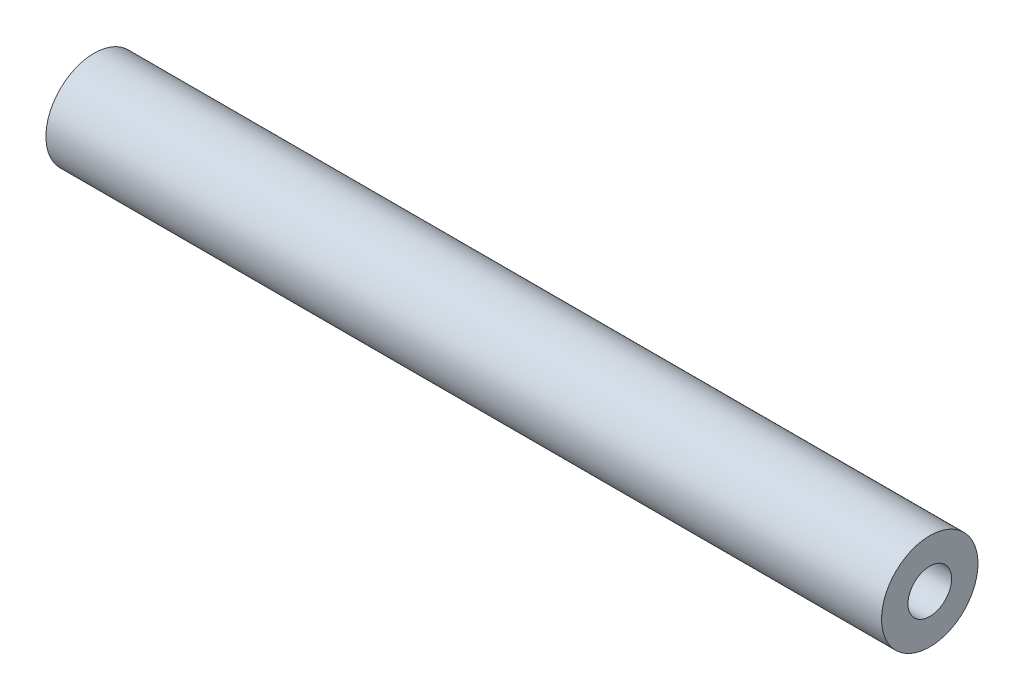
ISO-10303-21;
HEADER;
FILE_DESCRIPTION(('STEP AP214'),'2;1');
FILE_NAME('part.step','',(''),(''),'','','');
FILE_SCHEMA(('AUTOMOTIVE_DESIGN { 1 0 10303 214 1 1 1 1 }'));
ENDSEC;
DATA;
#1=APPLICATION_CONTEXT('core data for automotive mechanical design processes');
#2=APPLICATION_PROTOCOL_DEFINITION('international standard','automotive_design',2000,#1);
#3=PRODUCT_CONTEXT('',#1,'mechanical');
#4=PRODUCT('Part','Part','',(#3));
#5=PRODUCT_RELATED_PRODUCT_CATEGORY('part','',(#4));
#6=PRODUCT_DEFINITION_FORMATION('','',#4);
#7=PRODUCT_DEFINITION_CONTEXT('part definition',#1,'design');
#8=PRODUCT_DEFINITION('design','',#6,#7);
#9=PRODUCT_DEFINITION_SHAPE('','',#8);
#10=(LENGTH_UNIT() NAMED_UNIT(*) SI_UNIT(.MILLI.,.METRE.));
#11=(NAMED_UNIT(*) PLANE_ANGLE_UNIT() SI_UNIT($,.RADIAN.));
#12=(NAMED_UNIT(*) SI_UNIT($,.STERADIAN.) SOLID_ANGLE_UNIT());
#13=UNCERTAINTY_MEASURE_WITH_UNIT(LENGTH_MEASURE(1.E-05),#10,'distance_accuracy_value','');
#14=(GEOMETRIC_REPRESENTATION_CONTEXT(3) GLOBAL_UNCERTAINTY_ASSIGNED_CONTEXT((#13)) GLOBAL_UNIT_ASSIGNED_CONTEXT((#10,
#11,#12)) REPRESENTATION_CONTEXT('',''));
#15=CARTESIAN_POINT('',(0.,0.,0.));
#16=DIRECTION('',(0.,0.,1.));
#17=DIRECTION('',(1.,0.,0.));
#18=AXIS2_PLACEMENT_3D('',#15,#16,#17);
#19=CARTESIAN_POINT('',(82.55,0.,0.));
#20=DIRECTION('',(1.,0.,0.));
#21=DIRECTION('',(0.,0.,-1.));
#22=AXIS2_PLACEMENT_3D('',#19,#20,#21);
#23=PLANE('',#22);
#24=CARTESIAN_POINT('',(82.55,0.,0.));
#25=DIRECTION('',(1.,0.,0.));
#26=DIRECTION('',(0.,0.,-1.));
#27=AXIS2_PLACEMENT_3D('',#24,#25,#26);
#28=CIRCLE('',#27,4.7625);
#29=CARTESIAN_POINT('',(82.55,0.,-4.7625));
#30=VERTEX_POINT('',#29);
#31=EDGE_CURVE('E10',#30,#30,#28,.T.);
#32=ORIENTED_EDGE('',*,*,#31,.T.);
#33=EDGE_LOOP('',(#32));
#34=FACE_BOUND('',#33,.T.);
#35=CARTESIAN_POINT('',(82.55,0.,0.));
#36=DIRECTION('',(1.,0.,0.));
#37=DIRECTION('',(0.,0.,-1.));
#38=AXIS2_PLACEMENT_3D('',#35,#36,#37);
#39=CIRCLE('',#38,2.15265);
#40=CARTESIAN_POINT('',(82.55,0.,-2.15265));
#41=VERTEX_POINT('',#40);
#42=EDGE_CURVE('E42',#41,#41,#39,.T.);
#43=ORIENTED_EDGE('',*,*,#42,.F.);
#44=EDGE_LOOP('',(#43));
#45=FACE_BOUND('',#44,.T.);
#46=ADVANCED_FACE('F31',(#34,#45),#23,.T.);
#47=CARTESIAN_POINT('',(0.,0.,0.));
#48=DIRECTION('',(1.,0.,0.));
#49=DIRECTION('',(0.,0.,-1.));
#50=AXIS2_PLACEMENT_3D('',#47,#48,#49);
#51=PLANE('',#50);
#52=CARTESIAN_POINT('',(0.,0.,0.));
#53=DIRECTION('',(1.,0.,0.));
#54=DIRECTION('',(0.,0.,-1.));
#55=AXIS2_PLACEMENT_3D('',#52,#53,#54);
#56=CIRCLE('',#55,4.7625);
#57=CARTESIAN_POINT('',(0.,0.,-4.7625));
#58=VERTEX_POINT('',#57);
#59=EDGE_CURVE('E35',#58,#58,#56,.T.);
#60=ORIENTED_EDGE('',*,*,#59,.F.);
#61=EDGE_LOOP('',(#60));
#62=FACE_BOUND('',#61,.T.);
#63=CARTESIAN_POINT('',(0.,0.,0.));
#64=DIRECTION('',(1.,0.,0.));
#65=DIRECTION('',(0.,0.,-1.));
#66=AXIS2_PLACEMENT_3D('',#63,#64,#65);
#67=CIRCLE('',#66,2.15265);
#68=CARTESIAN_POINT('',(0.,0.,-2.15265));
#69=VERTEX_POINT('',#68);
#70=EDGE_CURVE('E44',#69,#69,#67,.T.);
#71=ORIENTED_EDGE('',*,*,#70,.T.);
#72=EDGE_LOOP('',(#71));
#73=FACE_BOUND('',#72,.T.);
#74=ADVANCED_FACE('F54',(#62,#73),#51,.F.);
#75=CARTESIAN_POINT('',(82.55,0.,0.));
#76=DIRECTION('',(-1.,0.,0.));
#77=DIRECTION('',(0.,0.,1.));
#78=AXIS2_PLACEMENT_3D('',#75,#76,#77);
#79=CYLINDRICAL_SURFACE('',#78,4.7625);
#80=ORIENTED_EDGE('',*,*,#31,.F.);
#81=EDGE_LOOP('',(#80));
#82=FACE_BOUND('',#81,.T.);
#83=ORIENTED_EDGE('',*,*,#59,.T.);
#84=EDGE_LOOP('',(#83));
#85=FACE_BOUND('',#84,.T.);
#86=ADVANCED_FACE('F33',(#82,#85),#79,.T.);
#87=CARTESIAN_POINT('',(82.55,0.,0.));
#88=DIRECTION('',(-1.,0.,0.));
#89=DIRECTION('',(0.,0.,1.));
#90=AXIS2_PLACEMENT_3D('',#87,#88,#89);
#91=CYLINDRICAL_SURFACE('',#90,2.15265);
#92=ORIENTED_EDGE('',*,*,#42,.T.);
#93=EDGE_LOOP('',(#92));
#94=FACE_BOUND('',#93,.T.);
#95=ORIENTED_EDGE('',*,*,#70,.F.);
#96=EDGE_LOOP('',(#95));
#97=FACE_BOUND('',#96,.T.);
#98=ADVANCED_FACE('F50',(#94,#97),#91,.F.);
#99=CLOSED_SHELL('',(#46,#74,#86,#98));
#100=MANIFOLD_SOLID_BREP('B2',#99);
#101=ADVANCED_BREP_SHAPE_REPRESENTATION('',(#18,#100),#14);
#102=SHAPE_DEFINITION_REPRESENTATION(#9,#101);
ENDSEC;
END-ISO-10303-21;
